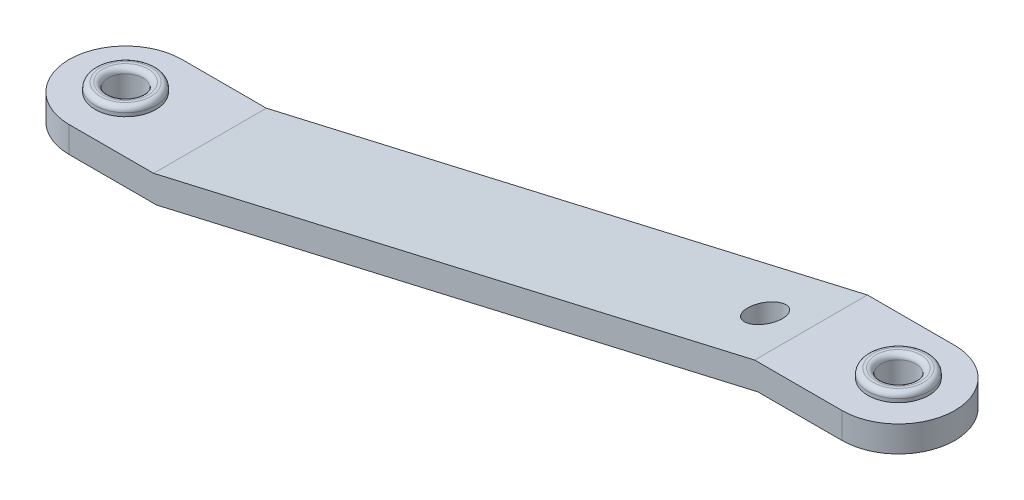
ISO-10303-21;
HEADER;
FILE_DESCRIPTION(('STEP AP214'),'2;1');
FILE_NAME('part.step','',(''),(''),'','','');
FILE_SCHEMA(('AUTOMOTIVE_DESIGN { 1 0 10303 214 1 1 1 1 }'));
ENDSEC;
DATA;
#1=APPLICATION_CONTEXT('core data for automotive mechanical design processes');
#2=APPLICATION_PROTOCOL_DEFINITION('international standard','automotive_design',2000,#1);
#3=PRODUCT_CONTEXT('',#1,'mechanical');
#4=PRODUCT('Part','Part','',(#3));
#5=PRODUCT_RELATED_PRODUCT_CATEGORY('part','',(#4));
#6=PRODUCT_DEFINITION_FORMATION('','',#4);
#7=PRODUCT_DEFINITION_CONTEXT('part definition',#1,'design');
#8=PRODUCT_DEFINITION('design','',#6,#7);
#9=PRODUCT_DEFINITION_SHAPE('','',#8);
#10=(LENGTH_UNIT() NAMED_UNIT(*) SI_UNIT(.MILLI.,.METRE.));
#11=(NAMED_UNIT(*) PLANE_ANGLE_UNIT() SI_UNIT($,.RADIAN.));
#12=(NAMED_UNIT(*) SI_UNIT($,.STERADIAN.) SOLID_ANGLE_UNIT());
#13=UNCERTAINTY_MEASURE_WITH_UNIT(LENGTH_MEASURE(1.E-05),#10,'distance_accuracy_value','');
#14=(GEOMETRIC_REPRESENTATION_CONTEXT(3) GLOBAL_UNCERTAINTY_ASSIGNED_CONTEXT((#13)) GLOBAL_UNIT_ASSIGNED_CONTEXT((#10,
#11,#12)) REPRESENTATION_CONTEXT('',''));
#15=CARTESIAN_POINT('',(0.,0.,0.));
#16=DIRECTION('',(0.,0.,1.));
#17=DIRECTION('',(1.,0.,0.));
#18=AXIS2_PLACEMENT_3D('',#15,#16,#17);
#19=CARTESIAN_POINT('',(396.018069942732,87.5,0.));
#20=DIRECTION('',(0.,-1.,0.));
#21=DIRECTION('',(0.,0.,-1.));
#22=AXIS2_PLACEMENT_3D('',#19,#20,#21);
#23=CYLINDRICAL_SURFACE('',#22,32.5);
#24=DIRECTION('',(0.,-1.,0.));
#25=VECTOR('',#24,1.);
#26=CARTESIAN_POINT('',(396.018069942732,0.,-32.5));
#27=LINE('',#26,#25);
#28=CARTESIAN_POINT('',(396.018069942732,87.5,-32.5));
#29=VERTEX_POINT('',#28);
#30=CARTESIAN_POINT('',(396.018069942732,72.5,-32.5));
#31=VERTEX_POINT('',#30);
#32=EDGE_CURVE('E165',#29,#31,#27,.T.);
#33=ORIENTED_EDGE('',*,*,#32,.F.);
#34=CARTESIAN_POINT('',(396.018069942732,87.5,0.));
#35=DIRECTION('',(0.,1.,0.));
#36=DIRECTION('',(0.,0.,1.));
#37=AXIS2_PLACEMENT_3D('',#34,#35,#36);
#38=CIRCLE('',#37,32.5);
#39=CARTESIAN_POINT('',(396.018069942732,87.5,32.5));
#40=VERTEX_POINT('',#39);
#41=EDGE_CURVE('E52',#40,#29,#38,.T.);
#42=ORIENTED_EDGE('',*,*,#41,.F.);
#43=DIRECTION('',(0.,1.,0.));
#44=VECTOR('',#43,1.);
#45=CARTESIAN_POINT('',(396.018069942732,87.5,32.5));
#46=LINE('',#45,#44);
#47=CARTESIAN_POINT('',(396.018069942732,72.5,32.5));
#48=VERTEX_POINT('',#47);
#49=EDGE_CURVE('E122',#48,#40,#46,.T.);
#50=ORIENTED_EDGE('',*,*,#49,.F.);
#51=CARTESIAN_POINT('',(396.018069942732,72.5,0.));
#52=DIRECTION('',(0.,1.,0.));
#53=DIRECTION('',(0.,0.,1.));
#54=AXIS2_PLACEMENT_3D('',#51,#52,#53);
#55=CIRCLE('',#54,32.5);
#56=EDGE_CURVE('E60',#31,#48,#55,.F.);
#57=ORIENTED_EDGE('',*,*,#56,.F.);
#58=EDGE_LOOP('',(#33,#42,#50,#57));
#59=FACE_BOUND('',#58,.T.);
#60=ADVANCED_FACE('F37',(#59),#23,.T.);
#61=CARTESIAN_POINT('',(-49.5,7.5,0.));
#62=DIRECTION('',(0.,1.,0.));
#63=DIRECTION('',(0.,0.,1.));
#64=AXIS2_PLACEMENT_3D('',#61,#62,#63);
#65=CYLINDRICAL_SURFACE('',#64,32.5);
#66=DIRECTION('',(0.,-1.,0.));
#67=VECTOR('',#66,1.);
#68=CARTESIAN_POINT('',(-49.5,7.5,32.5));
#69=LINE('',#68,#67);
#70=CARTESIAN_POINT('',(-49.5,7.5,32.5));
#71=VERTEX_POINT('',#70);
#72=CARTESIAN_POINT('',(-49.5,-7.5,32.5));
#73=VERTEX_POINT('',#72);
#74=EDGE_CURVE('E113',#71,#73,#69,.T.);
#75=ORIENTED_EDGE('',*,*,#74,.F.);
#76=CARTESIAN_POINT('',(-49.5,7.5,0.));
#77=DIRECTION('',(0.,1.,0.));
#78=DIRECTION('',(0.,0.,1.));
#79=AXIS2_PLACEMENT_3D('',#76,#77,#78);
#80=CIRCLE('',#79,32.5);
#81=CARTESIAN_POINT('',(-49.5,7.5,-32.5));
#82=VERTEX_POINT('',#81);
#83=EDGE_CURVE('E161',#82,#71,#80,.T.);
#84=ORIENTED_EDGE('',*,*,#83,.F.);
#85=DIRECTION('',(0.,1.,0.));
#86=VECTOR('',#85,1.);
#87=CARTESIAN_POINT('',(-49.5,0.,-32.5));
#88=LINE('',#87,#86);
#89=CARTESIAN_POINT('',(-49.5,-7.5,-32.5));
#90=VERTEX_POINT('',#89);
#91=EDGE_CURVE('E158',#90,#82,#88,.T.);
#92=ORIENTED_EDGE('',*,*,#91,.F.);
#93=CARTESIAN_POINT('',(-49.5,-7.5,0.));
#94=DIRECTION('',(0.,1.,0.));
#95=DIRECTION('',(0.,0.,1.));
#96=AXIS2_PLACEMENT_3D('',#93,#94,#95);
#97=CIRCLE('',#96,32.5);
#98=EDGE_CURVE('E163',#73,#90,#97,.F.);
#99=ORIENTED_EDGE('',*,*,#98,.F.);
#100=EDGE_LOOP('',(#75,#84,#92,#99));
#101=FACE_BOUND('',#100,.T.);
#102=ADVANCED_FACE('F233',(#101),#65,.T.);
#103=CARTESIAN_POINT('',(346.518069942732,72.5,32.5));
#104=DIRECTION('',(0.,1.,0.));
#105=DIRECTION('',(0.,0.,1.));
#106=AXIS2_PLACEMENT_3D('',#103,#104,#105);
#107=PLANE('',#106);
#108=CARTESIAN_POINT('',(396.018069942732,72.5,0.));
#109=DIRECTION('',(0.,1.,0.));
#110=DIRECTION('',(0.,0.,1.));
#111=AXIS2_PLACEMENT_3D('',#108,#109,#110);
#112=CIRCLE('',#111,17.4999999999999);
#113=CARTESIAN_POINT('',(396.018069942732,72.5,17.4999999999999));
#114=VERTEX_POINT('',#113);
#115=EDGE_CURVE('E178',#114,#114,#112,.T.);
#116=ORIENTED_EDGE('',*,*,#115,.T.);
#117=EDGE_LOOP('',(#116));
#118=FACE_BOUND('',#117,.T.);
#119=DIRECTION('',(1.,0.,0.));
#120=VECTOR('',#119,1.);
#121=CARTESIAN_POINT('',(346.518069942732,72.5,-32.5));
#122=LINE('',#121,#120);
#123=CARTESIAN_POINT('',(347.372587004994,72.5,-32.5));
#124=VERTEX_POINT('',#123);
#125=EDGE_CURVE('E138',#124,#31,#122,.T.);
#126=ORIENTED_EDGE('',*,*,#125,.T.);
#127=ORIENTED_EDGE('',*,*,#56,.T.);
#128=DIRECTION('',(1.,0.,0.));
#129=VECTOR('',#128,1.);
#130=CARTESIAN_POINT('',(346.518069942732,72.5,32.5));
#131=LINE('',#130,#129);
#132=CARTESIAN_POINT('',(347.372587004994,72.5,32.5));
#133=VERTEX_POINT('',#132);
#134=EDGE_CURVE('E123',#133,#48,#131,.T.);
#135=ORIENTED_EDGE('',*,*,#134,.F.);
#136=DIRECTION('',(0.,0.,-1.));
#137=VECTOR('',#136,1.);
#138=CARTESIAN_POINT('',(347.372587004994,72.5,32.5));
#139=LINE('',#138,#137);
#140=EDGE_CURVE('E137',#133,#124,#139,.T.);
#141=ORIENTED_EDGE('',*,*,#140,.T.);
#142=EDGE_LOOP('',(#126,#127,#135,#141));
#143=FACE_BOUND('',#142,.T.);
#144=ADVANCED_FACE('F238',(#118,#143),#107,.F.);
#145=CARTESIAN_POINT('',(346.518069942732,87.5,32.5));
#146=DIRECTION('',(0.,1.,0.));
#147=DIRECTION('',(0.,0.,1.));
#148=AXIS2_PLACEMENT_3D('',#145,#146,#147);
#149=PLANE('',#148);
#150=CARTESIAN_POINT('',(396.018069942732,87.5,0.));
#151=DIRECTION('',(0.,1.,0.));
#152=DIRECTION('',(0.,0.,1.));
#153=AXIS2_PLACEMENT_3D('',#150,#151,#152);
#154=CIRCLE('',#153,17.4999999999999);
#155=CARTESIAN_POINT('',(396.018069942732,87.5,17.4999999999999));
#156=VERTEX_POINT('',#155);
#157=EDGE_CURVE('E179',#156,#156,#154,.T.);
#158=ORIENTED_EDGE('',*,*,#157,.F.);
#159=EDGE_LOOP('',(#158));
#160=FACE_BOUND('',#159,.T.);
#161=DIRECTION('',(1.,0.,0.));
#162=VECTOR('',#161,1.);
#163=CARTESIAN_POINT('',(346.518069942732,87.5,32.5));
#164=LINE('',#163,#162);
#165=CARTESIAN_POINT('',(345.66355288047,87.5,32.5));
#166=VERTEX_POINT('',#165);
#167=EDGE_CURVE('E106',#166,#40,#164,.T.);
#168=ORIENTED_EDGE('',*,*,#167,.T.);
#169=ORIENTED_EDGE('',*,*,#41,.T.);
#170=DIRECTION('',(1.,0.,0.));
#171=VECTOR('',#170,1.);
#172=CARTESIAN_POINT('',(346.518069942732,87.5,-32.5));
#173=LINE('',#172,#171);
#174=CARTESIAN_POINT('',(345.66355288047,87.5,-32.5));
#175=VERTEX_POINT('',#174);
#176=EDGE_CURVE('E108',#175,#29,#173,.T.);
#177=ORIENTED_EDGE('',*,*,#176,.F.);
#178=DIRECTION('',(0.,0.,-1.));
#179=VECTOR('',#178,1.);
#180=CARTESIAN_POINT('',(345.66355288047,87.5,32.5));
#181=LINE('',#180,#179);
#182=EDGE_CURVE('E103',#166,#175,#181,.T.);
#183=ORIENTED_EDGE('',*,*,#182,.F.);
#184=EDGE_LOOP('',(#168,#169,#177,#183));
#185=FACE_BOUND('',#184,.T.);
#186=ADVANCED_FACE('F105',(#160,#185),#149,.T.);
#187=CARTESIAN_POINT('',(-1.68713290757899,7.30777548588926,32.5));
#188=DIRECTION('',(-0.224951054343865,0.974370064785235,0.));
#189=DIRECTION('',(-0.974370064785235,-0.224951054343865,0.));
#190=AXIS2_PLACEMENT_3D('',#187,#188,#189);
#191=PLANE('',#190);
#192=CARTESIAN_POINT('',(319.145482937738,81.3778211601803,0.));
#193=DIRECTION('',(-0.224951054343865,0.974370064785235,0.));
#194=DIRECTION('',(0.974370064785235,0.224951054343865,0.));
#195=AXIS2_PLACEMENT_3D('',#192,#193,#194);
#196=ELLIPSE('',#195,10.263041077934,10.);
#197=CARTESIAN_POINT('',(329.145482937738,83.686503071436,0.));
#198=VERTEX_POINT('',#197);
#199=EDGE_CURVE('E140',#198,#198,#196,.T.);
#200=ORIENTED_EDGE('',*,*,#199,.F.);
#201=EDGE_LOOP('',(#200));
#202=FACE_BOUND('',#201,.T.);
#203=DIRECTION('',(0.974370064785235,0.224951054343865,0.));
#204=VECTOR('',#203,1.);
#205=CARTESIAN_POINT('',(-1.68713290757899,7.30777548588926,-32.5));
#206=LINE('',#205,#204);
#207=CARTESIAN_POINT('',(-0.854517062262347,7.5,-32.5));
#208=VERTEX_POINT('',#207);
#209=EDGE_CURVE('E142',#208,#175,#206,.T.);
#210=ORIENTED_EDGE('',*,*,#209,.F.);
#211=DIRECTION('',(0.,0.,-1.));
#212=VECTOR('',#211,1.);
#213=CARTESIAN_POINT('',(-0.854517062262347,7.5,32.5));
#214=LINE('',#213,#212);
#215=CARTESIAN_POINT('',(-0.854517062262347,7.5,32.5));
#216=VERTEX_POINT('',#215);
#217=EDGE_CURVE('E114',#216,#208,#214,.T.);
#218=ORIENTED_EDGE('',*,*,#217,.F.);
#219=DIRECTION('',(0.974370064785235,0.224951054343865,0.));
#220=VECTOR('',#219,1.);
#221=CARTESIAN_POINT('',(-1.68713290757899,7.30777548588926,32.5));
#222=LINE('',#221,#220);
#223=EDGE_CURVE('E121',#216,#166,#222,.T.);
#224=ORIENTED_EDGE('',*,*,#223,.T.);
#225=ORIENTED_EDGE('',*,*,#182,.T.);
#226=EDGE_LOOP('',(#210,#218,#224,#225));
#227=FACE_BOUND('',#226,.T.);
#228=ADVANCED_FACE('F126',(#202,#227),#191,.T.);
#229=CARTESIAN_POINT('',(-82.,7.5,32.5));
#230=DIRECTION('',(0.,1.,0.));
#231=DIRECTION('',(0.,0.,1.));
#232=AXIS2_PLACEMENT_3D('',#229,#230,#231);
#233=PLANE('',#232);
#234=CARTESIAN_POINT('',(-49.5,7.5,0.));
#235=DIRECTION('',(0.,1.,0.));
#236=DIRECTION('',(0.,0.,1.));
#237=AXIS2_PLACEMENT_3D('',#234,#235,#236);
#238=CIRCLE('',#237,17.5);
#239=CARTESIAN_POINT('',(-49.5,7.5,17.5));
#240=VERTEX_POINT('',#239);
#241=EDGE_CURVE('E171',#240,#240,#238,.T.);
#242=ORIENTED_EDGE('',*,*,#241,.F.);
#243=EDGE_LOOP('',(#242));
#244=FACE_BOUND('',#243,.T.);
#245=DIRECTION('',(1.,0.,0.));
#246=VECTOR('',#245,1.);
#247=CARTESIAN_POINT('',(-82.,7.5,-32.5));
#248=LINE('',#247,#246);
#249=EDGE_CURVE('E144',#82,#208,#248,.T.);
#250=ORIENTED_EDGE('',*,*,#249,.F.);
#251=ORIENTED_EDGE('',*,*,#83,.T.);
#252=DIRECTION('',(1.,0.,0.));
#253=VECTOR('',#252,1.);
#254=CARTESIAN_POINT('',(-82.,7.5,32.5));
#255=LINE('',#254,#253);
#256=EDGE_CURVE('E128',#71,#216,#255,.T.);
#257=ORIENTED_EDGE('',*,*,#256,.T.);
#258=ORIENTED_EDGE('',*,*,#217,.T.);
#259=EDGE_LOOP('',(#250,#251,#257,#258));
#260=FACE_BOUND('',#259,.T.);
#261=ADVANCED_FACE('F322',(#244,#260),#233,.T.);
#262=CARTESIAN_POINT('',(-82.,-7.5,32.5));
#263=DIRECTION('',(0.,1.,0.));
#264=DIRECTION('',(0.,0.,1.));
#265=AXIS2_PLACEMENT_3D('',#262,#263,#264);
#266=PLANE('',#265);
#267=CARTESIAN_POINT('',(-49.5,-7.5,0.));
#268=DIRECTION('',(0.,1.,0.));
#269=DIRECTION('',(0.,0.,1.));
#270=AXIS2_PLACEMENT_3D('',#267,#268,#269);
#271=CIRCLE('',#270,17.5);
#272=CARTESIAN_POINT('',(-49.5,-7.5,17.5));
#273=VERTEX_POINT('',#272);
#274=EDGE_CURVE('E175',#273,#273,#271,.T.);
#275=ORIENTED_EDGE('',*,*,#274,.T.);
#276=EDGE_LOOP('',(#275));
#277=FACE_BOUND('',#276,.T.);
#278=DIRECTION('',(1.,0.,0.));
#279=VECTOR('',#278,1.);
#280=CARTESIAN_POINT('',(-82.,-7.5,32.5));
#281=LINE('',#280,#279);
#282=CARTESIAN_POINT('',(0.854517062262347,-7.5,32.5));
#283=VERTEX_POINT('',#282);
#284=EDGE_CURVE('E130',#73,#283,#281,.T.);
#285=ORIENTED_EDGE('',*,*,#284,.F.);
#286=ORIENTED_EDGE('',*,*,#98,.T.);
#287=DIRECTION('',(1.,0.,0.));
#288=VECTOR('',#287,1.);
#289=CARTESIAN_POINT('',(-82.,-7.5,-32.5));
#290=LINE('',#289,#288);
#291=CARTESIAN_POINT('',(0.854517062262347,-7.5,-32.5));
#292=VERTEX_POINT('',#291);
#293=EDGE_CURVE('E146',#90,#292,#290,.T.);
#294=ORIENTED_EDGE('',*,*,#293,.T.);
#295=DIRECTION('',(0.,0.,-1.));
#296=VECTOR('',#295,1.);
#297=CARTESIAN_POINT('',(0.854517062262347,-7.5,32.5));
#298=LINE('',#297,#296);
#299=EDGE_CURVE('E152',#283,#292,#298,.T.);
#300=ORIENTED_EDGE('',*,*,#299,.F.);
#301=EDGE_LOOP('',(#285,#286,#294,#300));
#302=FACE_BOUND('',#301,.T.);
#303=ADVANCED_FACE('F318',(#277,#302),#266,.F.);
#304=CARTESIAN_POINT('',(1.68713290757899,-7.30777548588926,32.5));
#305=DIRECTION('',(-0.224951054343865,0.974370064785235,0.));
#306=DIRECTION('',(-0.974370064785235,-0.224951054343865,0.));
#307=AXIS2_PLACEMENT_3D('',#304,#305,#306);
#308=PLANE('',#307);
#309=CARTESIAN_POINT('',(319.145482937738,65.9832595432794,0.));
#310=DIRECTION('',(-0.224951054343865,0.974370064785235,0.));
#311=DIRECTION('',(0.974370064785235,0.224951054343865,0.));
#312=AXIS2_PLACEMENT_3D('',#309,#310,#311);
#313=ELLIPSE('',#312,10.263041077934,10.);
#314=CARTESIAN_POINT('',(329.145482937738,68.2919414545351,0.));
#315=VERTEX_POINT('',#314);
#316=EDGE_CURVE('E172',#315,#315,#313,.T.);
#317=ORIENTED_EDGE('',*,*,#316,.T.);
#318=EDGE_LOOP('',(#317));
#319=FACE_BOUND('',#318,.T.);
#320=DIRECTION('',(0.974370064785235,0.224951054343865,0.));
#321=VECTOR('',#320,1.);
#322=CARTESIAN_POINT('',(1.68713290757899,-7.30777548588926,-32.5));
#323=LINE('',#322,#321);
#324=EDGE_CURVE('E148',#292,#124,#323,.T.);
#325=ORIENTED_EDGE('',*,*,#324,.T.);
#326=ORIENTED_EDGE('',*,*,#140,.F.);
#327=DIRECTION('',(0.974370064785235,0.224951054343865,0.));
#328=VECTOR('',#327,1.);
#329=CARTESIAN_POINT('',(1.68713290757899,-7.30777548588926,32.5));
#330=LINE('',#329,#328);
#331=EDGE_CURVE('E135',#283,#133,#330,.T.);
#332=ORIENTED_EDGE('',*,*,#331,.F.);
#333=ORIENTED_EDGE('',*,*,#299,.T.);
#334=EDGE_LOOP('',(#325,#326,#332,#333));
#335=FACE_BOUND('',#334,.T.);
#336=ADVANCED_FACE('F312',(#319,#335),#308,.F.);
#337=CARTESIAN_POINT('',(0.,0.,32.5));
#338=DIRECTION('',(0.,0.,-1.));
#339=DIRECTION('',(-1.,0.,0.));
#340=AXIS2_PLACEMENT_3D('',#337,#338,#339);
#341=PLANE('',#340);
#342=ORIENTED_EDGE('',*,*,#134,.T.);
#343=ORIENTED_EDGE('',*,*,#49,.T.);
#344=ORIENTED_EDGE('',*,*,#167,.F.);
#345=ORIENTED_EDGE('',*,*,#223,.F.);
#346=ORIENTED_EDGE('',*,*,#256,.F.);
#347=ORIENTED_EDGE('',*,*,#74,.T.);
#348=ORIENTED_EDGE('',*,*,#284,.T.);
#349=ORIENTED_EDGE('',*,*,#331,.T.);
#350=EDGE_LOOP('',(#342,#343,#344,#345,#346,#347,#348,#349));
#351=FACE_BOUND('',#350,.T.);
#352=ADVANCED_FACE('F119',(#351),#341,.F.);
#353=CARTESIAN_POINT('',(0.,0.,-32.5));
#354=DIRECTION('',(0.,0.,-1.));
#355=DIRECTION('',(-1.,0.,0.));
#356=AXIS2_PLACEMENT_3D('',#353,#354,#355);
#357=PLANE('',#356);
#358=ORIENTED_EDGE('',*,*,#176,.T.);
#359=ORIENTED_EDGE('',*,*,#32,.T.);
#360=ORIENTED_EDGE('',*,*,#125,.F.);
#361=ORIENTED_EDGE('',*,*,#324,.F.);
#362=ORIENTED_EDGE('',*,*,#293,.F.);
#363=ORIENTED_EDGE('',*,*,#91,.T.);
#364=ORIENTED_EDGE('',*,*,#249,.T.);
#365=ORIENTED_EDGE('',*,*,#209,.T.);
#366=EDGE_LOOP('',(#358,#359,#360,#361,#362,#363,#364,#365));
#367=FACE_BOUND('',#366,.T.);
#368=ADVANCED_FACE('F308',(#367),#357,.T.);
#369=CARTESIAN_POINT('',(319.145482937738,-7.50000000000001,0.));
#370=DIRECTION('',(0.,1.,0.));
#371=DIRECTION('',(0.,0.,1.));
#372=AXIS2_PLACEMENT_3D('',#369,#370,#371);
#373=CYLINDRICAL_SURFACE('',#372,10.);
#374=ORIENTED_EDGE('',*,*,#199,.T.);
#375=EDGE_LOOP('',(#374));
#376=FACE_BOUND('',#375,.T.);
#377=ORIENTED_EDGE('',*,*,#316,.F.);
#378=EDGE_LOOP('',(#377));
#379=FACE_BOUND('',#378,.T.);
#380=ADVANCED_FACE('F296',(#376,#379),#373,.F.);
#381=CARTESIAN_POINT('',(0.,-12.5,0.));
#382=DIRECTION('',(0.,1.,0.));
#383=DIRECTION('',(0.,0.,1.));
#384=AXIS2_PLACEMENT_3D('',#381,#382,#383);
#385=PLANE('',#384);
#386=CARTESIAN_POINT('',(-49.5,-12.5,0.));
#387=DIRECTION('',(0.,1.,0.));
#388=DIRECTION('',(0.,0.,1.));
#389=AXIS2_PLACEMENT_3D('',#386,#387,#388);
#390=CIRCLE('',#389,14.5);
#391=CARTESIAN_POINT('',(-49.5,-12.5,14.5));
#392=VERTEX_POINT('',#391);
#393=EDGE_CURVE('E200',#392,#392,#390,.F.);
#394=ORIENTED_EDGE('',*,*,#393,.T.);
#395=EDGE_LOOP('',(#394));
#396=FACE_BOUND('',#395,.T.);
#397=CARTESIAN_POINT('',(-49.5,-12.5,0.));
#398=DIRECTION('',(0.,1.,0.));
#399=DIRECTION('',(0.,0.,1.));
#400=AXIS2_PLACEMENT_3D('',#397,#398,#399);
#401=CIRCLE('',#400,13.);
#402=CARTESIAN_POINT('',(-49.5,-12.5,13.));
#403=VERTEX_POINT('',#402);
#404=EDGE_CURVE('E197',#403,#403,#401,.T.);
#405=ORIENTED_EDGE('',*,*,#404,.T.);
#406=EDGE_LOOP('',(#405));
#407=FACE_BOUND('',#406,.T.);
#408=ADVANCED_FACE('F294',(#396,#407),#385,.F.);
#409=CARTESIAN_POINT('',(-49.5,-12.5,0.));
#410=DIRECTION('',(0.,1.,0.));
#411=DIRECTION('',(0.,0.,1.));
#412=AXIS2_PLACEMENT_3D('',#409,#410,#411);
#413=CYLINDRICAL_SURFACE('',#412,17.5);
#414=CARTESIAN_POINT('',(-49.5,-9.5,0.));
#415=DIRECTION('',(0.,1.,0.));
#416=DIRECTION('',(0.,0.,1.));
#417=AXIS2_PLACEMENT_3D('',#414,#415,#416);
#418=CIRCLE('',#417,17.5);
#419=CARTESIAN_POINT('',(-49.5,-9.5,17.5));
#420=VERTEX_POINT('',#419);
#421=EDGE_CURVE('E194',#420,#420,#418,.T.);
#422=ORIENTED_EDGE('',*,*,#421,.T.);
#423=EDGE_LOOP('',(#422));
#424=FACE_BOUND('',#423,.T.);
#425=ORIENTED_EDGE('',*,*,#274,.F.);
#426=EDGE_LOOP('',(#425));
#427=FACE_BOUND('',#426,.T.);
#428=ADVANCED_FACE('F290',(#424,#427),#413,.T.);
#429=CARTESIAN_POINT('',(-49.5,-7.50000000000001,0.));
#430=DIRECTION('',(0.,1.,0.));
#431=DIRECTION('',(0.,0.,1.));
#432=AXIS2_PLACEMENT_3D('',#429,#430,#431);
#433=CYLINDRICAL_SURFACE('',#432,10.);
#434=CARTESIAN_POINT('',(-49.5,-9.5,0.));
#435=DIRECTION('',(0.,1.,0.));
#436=DIRECTION('',(0.,0.,1.));
#437=AXIS2_PLACEMENT_3D('',#434,#435,#436);
#438=CIRCLE('',#437,10.);
#439=CARTESIAN_POINT('',(-49.5,-9.5,10.));
#440=VERTEX_POINT('',#439);
#441=EDGE_CURVE('E206',#440,#440,#438,.F.);
#442=ORIENTED_EDGE('',*,*,#441,.T.);
#443=EDGE_LOOP('',(#442));
#444=FACE_BOUND('',#443,.T.);
#445=CARTESIAN_POINT('',(-49.5,9.5,0.));
#446=DIRECTION('',(0.,1.,0.));
#447=DIRECTION('',(0.,0.,1.));
#448=AXIS2_PLACEMENT_3D('',#445,#446,#447);
#449=CIRCLE('',#448,10.);
#450=CARTESIAN_POINT('',(-49.5,9.5,10.));
#451=VERTEX_POINT('',#450);
#452=EDGE_CURVE('E203',#451,#451,#449,.T.);
#453=ORIENTED_EDGE('',*,*,#452,.T.);
#454=EDGE_LOOP('',(#453));
#455=FACE_BOUND('',#454,.T.);
#456=ADVANCED_FACE('F287',(#444,#455),#433,.F.);
#457=CARTESIAN_POINT('',(-49.5,9.5,0.));
#458=DIRECTION('',(0.,1.,0.));
#459=DIRECTION('',(0.,0.,1.));
#460=AXIS2_PLACEMENT_3D('',#457,#458,#459);
#461=CIRCLE('',#460,17.5);
#462=CARTESIAN_POINT('',(-49.5,9.5,17.5));
#463=VERTEX_POINT('',#462);
#464=EDGE_CURVE('E215',#463,#463,#461,.F.);
#465=ORIENTED_EDGE('',*,*,#464,.T.);
#466=EDGE_LOOP('',(#465));
#467=FACE_BOUND('',#466,.T.);
#468=ORIENTED_EDGE('',*,*,#241,.T.);
#469=EDGE_LOOP('',(#468));
#470=FACE_BOUND('',#469,.T.);
#471=ADVANCED_FACE('F276',(#467,#470),#413,.T.);
#472=CARTESIAN_POINT('',(0.,12.5,0.));
#473=DIRECTION('',(0.,1.,0.));
#474=DIRECTION('',(0.,0.,1.));
#475=AXIS2_PLACEMENT_3D('',#472,#473,#474);
#476=PLANE('',#475);
#477=CARTESIAN_POINT('',(-49.5,12.5,0.));
#478=DIRECTION('',(0.,1.,0.));
#479=DIRECTION('',(0.,0.,1.));
#480=AXIS2_PLACEMENT_3D('',#477,#478,#479);
#481=CIRCLE('',#480,14.5);
#482=CARTESIAN_POINT('',(-49.5,12.5,14.5));
#483=VERTEX_POINT('',#482);
#484=EDGE_CURVE('E212',#483,#483,#481,.T.);
#485=ORIENTED_EDGE('',*,*,#484,.T.);
#486=EDGE_LOOP('',(#485));
#487=FACE_BOUND('',#486,.T.);
#488=CARTESIAN_POINT('',(-49.5,12.5,0.));
#489=DIRECTION('',(0.,1.,0.));
#490=DIRECTION('',(0.,0.,1.));
#491=AXIS2_PLACEMENT_3D('',#488,#489,#490);
#492=CIRCLE('',#491,13.);
#493=CARTESIAN_POINT('',(-49.5,12.5,13.));
#494=VERTEX_POINT('',#493);
#495=EDGE_CURVE('E209',#494,#494,#492,.F.);
#496=ORIENTED_EDGE('',*,*,#495,.T.);
#497=EDGE_LOOP('',(#496));
#498=FACE_BOUND('',#497,.T.);
#499=ADVANCED_FACE('F272',(#487,#498),#476,.T.);
#500=CARTESIAN_POINT('',(0.,92.5,0.));
#501=DIRECTION('',(0.,1.,0.));
#502=DIRECTION('',(0.,0.,1.));
#503=AXIS2_PLACEMENT_3D('',#500,#501,#502);
#504=PLANE('',#503);
#505=CARTESIAN_POINT('',(396.018069942732,92.5,0.));
#506=DIRECTION('',(0.,1.,0.));
#507=DIRECTION('',(0.,0.,1.));
#508=AXIS2_PLACEMENT_3D('',#505,#506,#507);
#509=CIRCLE('',#508,14.4999999999999);
#510=CARTESIAN_POINT('',(396.018069942732,92.5,14.4999999999999));
#511=VERTEX_POINT('',#510);
#512=EDGE_CURVE('E185',#511,#511,#509,.T.);
#513=ORIENTED_EDGE('',*,*,#512,.T.);
#514=EDGE_LOOP('',(#513));
#515=FACE_BOUND('',#514,.T.);
#516=CARTESIAN_POINT('',(396.018069942732,92.5,0.));
#517=DIRECTION('',(0.,1.,0.));
#518=DIRECTION('',(0.,0.,1.));
#519=AXIS2_PLACEMENT_3D('',#516,#517,#518);
#520=CIRCLE('',#519,13.);
#521=CARTESIAN_POINT('',(396.018069942732,92.5,13.));
#522=VERTEX_POINT('',#521);
#523=EDGE_CURVE('E182',#522,#522,#520,.F.);
#524=ORIENTED_EDGE('',*,*,#523,.T.);
#525=EDGE_LOOP('',(#524));
#526=FACE_BOUND('',#525,.T.);
#527=ADVANCED_FACE('F275',(#515,#526),#504,.T.);
#528=CARTESIAN_POINT('',(396.018069942732,67.5,0.));
#529=DIRECTION('',(0.,1.,0.));
#530=DIRECTION('',(0.,0.,1.));
#531=AXIS2_PLACEMENT_3D('',#528,#529,#530);
#532=CYLINDRICAL_SURFACE('',#531,17.4999999999999);
#533=CARTESIAN_POINT('',(396.018069942732,89.5,0.));
#534=DIRECTION('',(0.,1.,0.));
#535=DIRECTION('',(0.,0.,1.));
#536=AXIS2_PLACEMENT_3D('',#533,#534,#535);
#537=CIRCLE('',#536,17.4999999999999);
#538=CARTESIAN_POINT('',(396.018069942732,89.5,17.4999999999999));
#539=VERTEX_POINT('',#538);
#540=EDGE_CURVE('E188',#539,#539,#537,.F.);
#541=ORIENTED_EDGE('',*,*,#540,.T.);
#542=EDGE_LOOP('',(#541));
#543=FACE_BOUND('',#542,.T.);
#544=ORIENTED_EDGE('',*,*,#157,.T.);
#545=EDGE_LOOP('',(#544));
#546=FACE_BOUND('',#545,.T.);
#547=ADVANCED_FACE('F284',(#543,#546),#532,.T.);
#548=CARTESIAN_POINT('',(396.018069942732,-7.50000000000001,0.));
#549=DIRECTION('',(0.,1.,0.));
#550=DIRECTION('',(0.,0.,1.));
#551=AXIS2_PLACEMENT_3D('',#548,#549,#550);
#552=CYLINDRICAL_SURFACE('',#551,9.99999999999998);
#553=CARTESIAN_POINT('',(396.018069942732,89.5,0.));
#554=DIRECTION('',(0.,1.,0.));
#555=DIRECTION('',(0.,0.,1.));
#556=AXIS2_PLACEMENT_3D('',#553,#554,#555);
#557=CIRCLE('',#556,9.99999999999998);
#558=CARTESIAN_POINT('',(396.018069942732,89.5,9.99999999999998));
#559=VERTEX_POINT('',#558);
#560=EDGE_CURVE('E191',#559,#559,#557,.T.);
#561=ORIENTED_EDGE('',*,*,#560,.T.);
#562=EDGE_LOOP('',(#561));
#563=FACE_BOUND('',#562,.T.);
#564=CARTESIAN_POINT('',(396.018069942732,67.5,0.));
#565=DIRECTION('',(0.,1.,0.));
#566=DIRECTION('',(0.,0.,1.));
#567=AXIS2_PLACEMENT_3D('',#564,#565,#566);
#568=CIRCLE('',#567,9.99999999999998);
#569=CARTESIAN_POINT('',(396.018069942732,67.5,9.99999999999998));
#570=VERTEX_POINT('',#569);
#571=EDGE_CURVE('E349',#570,#570,#568,.F.);
#572=ORIENTED_EDGE('',*,*,#571,.T.);
#573=EDGE_LOOP('',(#572));
#574=FACE_BOUND('',#573,.T.);
#575=ADVANCED_FACE('F299',(#563,#574),#552,.F.);
#576=CARTESIAN_POINT('',(396.018069942732,70.5,0.));
#577=DIRECTION('',(0.,1.,0.));
#578=DIRECTION('',(0.,0.,1.));
#579=AXIS2_PLACEMENT_3D('',#576,#577,#578);
#580=CIRCLE('',#579,17.4999999999999);
#581=CARTESIAN_POINT('',(396.018069942732,70.5,17.4999999999999));
#582=VERTEX_POINT('',#581);
#583=EDGE_CURVE('E45',#582,#582,#580,.T.);
#584=ORIENTED_EDGE('',*,*,#583,.T.);
#585=EDGE_LOOP('',(#584));
#586=FACE_BOUND('',#585,.T.);
#587=ORIENTED_EDGE('',*,*,#115,.F.);
#588=EDGE_LOOP('',(#587));
#589=FACE_BOUND('',#588,.T.);
#590=ADVANCED_FACE('F220',(#586,#589),#532,.T.);
#591=CARTESIAN_POINT('',(0.,67.5,0.));
#592=DIRECTION('',(0.,1.,0.));
#593=DIRECTION('',(0.,0.,1.));
#594=AXIS2_PLACEMENT_3D('',#591,#592,#593);
#595=PLANE('',#594);
#596=CARTESIAN_POINT('',(396.018069942732,67.5,0.));
#597=DIRECTION('',(0.,1.,0.));
#598=DIRECTION('',(0.,0.,1.));
#599=AXIS2_PLACEMENT_3D('',#596,#597,#598);
#600=CIRCLE('',#599,14.4999999999999);
#601=CARTESIAN_POINT('',(396.018069942732,67.5,14.4999999999999));
#602=VERTEX_POINT('',#601);
#603=EDGE_CURVE('E11',#602,#602,#600,.F.);
#604=ORIENTED_EDGE('',*,*,#603,.T.);
#605=EDGE_LOOP('',(#604));
#606=FACE_BOUND('',#605,.T.);
#607=ORIENTED_EDGE('',*,*,#571,.F.);
#608=EDGE_LOOP('',(#607));
#609=FACE_BOUND('',#608,.T.);
#610=ADVANCED_FACE('F251',(#606,#609),#595,.F.);
#611=CARTESIAN_POINT('',(396.018069942732,89.5,0.));
#612=DIRECTION('',(0.,1.,0.));
#613=DIRECTION('',(0.,0.,1.));
#614=AXIS2_PLACEMENT_3D('',#611,#612,#613);
#615=TOROIDAL_SURFACE('',#614,14.4999999999999,3.);
#616=ORIENTED_EDGE('',*,*,#540,.F.);
#617=EDGE_LOOP('',(#616));
#618=FACE_BOUND('',#617,.T.);
#619=ORIENTED_EDGE('',*,*,#512,.F.);
#620=EDGE_LOOP('',(#619));
#621=FACE_BOUND('',#620,.T.);
#622=ADVANCED_FACE('F247',(#618,#621),#615,.T.);
#623=CARTESIAN_POINT('',(396.018069942732,89.5,0.));
#624=DIRECTION('',(0.,1.,0.));
#625=DIRECTION('',(0.,0.,1.));
#626=AXIS2_PLACEMENT_3D('',#623,#624,#625);
#627=TOROIDAL_SURFACE('',#626,13.,3.);
#628=ORIENTED_EDGE('',*,*,#560,.F.);
#629=EDGE_LOOP('',(#628));
#630=FACE_BOUND('',#629,.T.);
#631=ORIENTED_EDGE('',*,*,#523,.F.);
#632=EDGE_LOOP('',(#631));
#633=FACE_BOUND('',#632,.T.);
#634=ADVANCED_FACE('F250',(#630,#633),#627,.T.);
#635=CARTESIAN_POINT('',(-49.5,-9.5,0.));
#636=DIRECTION('',(0.,1.,0.));
#637=DIRECTION('',(0.,0.,1.));
#638=AXIS2_PLACEMENT_3D('',#635,#636,#637);
#639=TOROIDAL_SURFACE('',#638,14.5,3.);
#640=ORIENTED_EDGE('',*,*,#393,.F.);
#641=EDGE_LOOP('',(#640));
#642=FACE_BOUND('',#641,.T.);
#643=ORIENTED_EDGE('',*,*,#421,.F.);
#644=EDGE_LOOP('',(#643));
#645=FACE_BOUND('',#644,.T.);
#646=ADVANCED_FACE('F255',(#642,#645),#639,.T.);
#647=CARTESIAN_POINT('',(-49.5,-9.5,0.));
#648=DIRECTION('',(0.,1.,0.));
#649=DIRECTION('',(0.,0.,1.));
#650=AXIS2_PLACEMENT_3D('',#647,#648,#649);
#651=TOROIDAL_SURFACE('',#650,13.,3.);
#652=ORIENTED_EDGE('',*,*,#404,.F.);
#653=EDGE_LOOP('',(#652));
#654=FACE_BOUND('',#653,.T.);
#655=ORIENTED_EDGE('',*,*,#441,.F.);
#656=EDGE_LOOP('',(#655));
#657=FACE_BOUND('',#656,.T.);
#658=ADVANCED_FACE('F259',(#654,#657),#651,.T.);
#659=CARTESIAN_POINT('',(-49.5,9.5,0.));
#660=DIRECTION('',(0.,1.,0.));
#661=DIRECTION('',(0.,0.,1.));
#662=AXIS2_PLACEMENT_3D('',#659,#660,#661);
#663=TOROIDAL_SURFACE('',#662,14.5,3.);
#664=ORIENTED_EDGE('',*,*,#464,.F.);
#665=EDGE_LOOP('',(#664));
#666=FACE_BOUND('',#665,.T.);
#667=ORIENTED_EDGE('',*,*,#484,.F.);
#668=EDGE_LOOP('',(#667));
#669=FACE_BOUND('',#668,.T.);
#670=ADVANCED_FACE('F229',(#666,#669),#663,.T.);
#671=CARTESIAN_POINT('',(-49.5,9.5,0.));
#672=DIRECTION('',(0.,1.,0.));
#673=DIRECTION('',(0.,0.,1.));
#674=AXIS2_PLACEMENT_3D('',#671,#672,#673);
#675=TOROIDAL_SURFACE('',#674,13.,3.);
#676=ORIENTED_EDGE('',*,*,#452,.F.);
#677=EDGE_LOOP('',(#676));
#678=FACE_BOUND('',#677,.T.);
#679=ORIENTED_EDGE('',*,*,#495,.F.);
#680=EDGE_LOOP('',(#679));
#681=FACE_BOUND('',#680,.T.);
#682=ADVANCED_FACE('F224',(#678,#681),#675,.T.);
#683=CARTESIAN_POINT('',(396.018069942732,70.5,0.));
#684=DIRECTION('',(0.,1.,0.));
#685=DIRECTION('',(0.,0.,1.));
#686=AXIS2_PLACEMENT_3D('',#683,#684,#685);
#687=TOROIDAL_SURFACE('',#686,14.4999999999999,3.);
#688=ORIENTED_EDGE('',*,*,#603,.F.);
#689=EDGE_LOOP('',(#688));
#690=FACE_BOUND('',#689,.T.);
#691=ORIENTED_EDGE('',*,*,#583,.F.);
#692=EDGE_LOOP('',(#691));
#693=FACE_BOUND('',#692,.T.);
#694=ADVANCED_FACE('F39',(#690,#693),#687,.T.);
#695=CLOSED_SHELL('',(#60,#102,#144,#186,#228,#261,#303,#336,#352,#368,#380,#408,#428,#456,#471,
#499,#527,#547,#575,#590,#610,#622,#634,#646,#658,#670,#682,#694));
#696=MANIFOLD_SOLID_BREP('B2',#695);
#697=ADVANCED_BREP_SHAPE_REPRESENTATION('',(#18,#696),#14);
#698=SHAPE_DEFINITION_REPRESENTATION(#9,#697);
ENDSEC;
END-ISO-10303-21;
